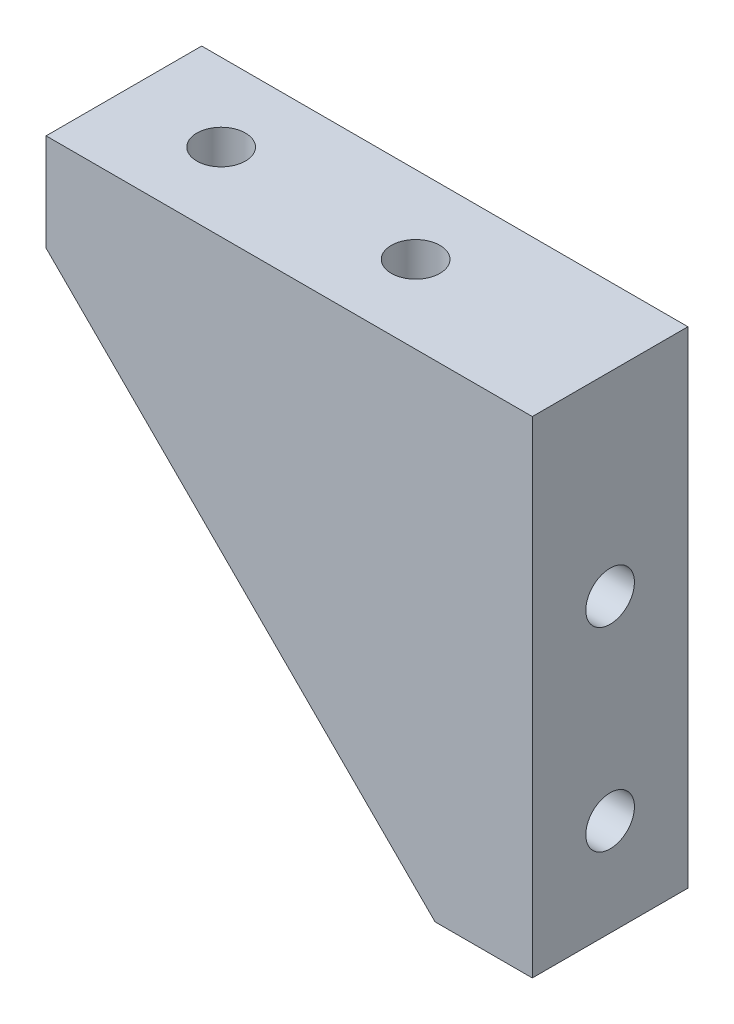
ISO-10303-21;
HEADER;
FILE_DESCRIPTION(('STEP AP214'),'2;1');
FILE_NAME('part.step','',(''),(''),'','','');
FILE_SCHEMA(('AUTOMOTIVE_DESIGN { 1 0 10303 214 1 1 1 1 }'));
ENDSEC;
DATA;
#1=APPLICATION_CONTEXT('core data for automotive mechanical design processes');
#2=APPLICATION_PROTOCOL_DEFINITION('international standard','automotive_design',2000,#1);
#3=PRODUCT_CONTEXT('',#1,'mechanical');
#4=PRODUCT('Part','Part','',(#3));
#5=PRODUCT_RELATED_PRODUCT_CATEGORY('part','',(#4));
#6=PRODUCT_DEFINITION_FORMATION('','',#4);
#7=PRODUCT_DEFINITION_CONTEXT('part definition',#1,'design');
#8=PRODUCT_DEFINITION('design','',#6,#7);
#9=PRODUCT_DEFINITION_SHAPE('','',#8);
#10=(LENGTH_UNIT() NAMED_UNIT(*) SI_UNIT(.MILLI.,.METRE.));
#11=(NAMED_UNIT(*) PLANE_ANGLE_UNIT() SI_UNIT($,.RADIAN.));
#12=(NAMED_UNIT(*) SI_UNIT($,.STERADIAN.) SOLID_ANGLE_UNIT());
#13=UNCERTAINTY_MEASURE_WITH_UNIT(LENGTH_MEASURE(1.E-05),#10,'distance_accuracy_value','');
#14=(GEOMETRIC_REPRESENTATION_CONTEXT(3) GLOBAL_UNCERTAINTY_ASSIGNED_CONTEXT((#13)) GLOBAL_UNIT_ASSIGNED_CONTEXT((#10,
#11,#12)) REPRESENTATION_CONTEXT('',''));
#15=CARTESIAN_POINT('',(0.,0.,0.));
#16=DIRECTION('',(0.,0.,1.));
#17=DIRECTION('',(1.,0.,0.));
#18=AXIS2_PLACEMENT_3D('',#15,#16,#17);
#19=CARTESIAN_POINT('',(2.5,-37.5,4.));
#20=DIRECTION('',(0.,1.,0.));
#21=DIRECTION('',(0.,0.,1.));
#22=AXIS2_PLACEMENT_3D('',#19,#20,#21);
#23=CYLINDRICAL_SURFACE('',#22,1.25);
#24=CARTESIAN_POINT('',(2.5,2.5,4.));
#25=DIRECTION('',(-0.707106781186548,0.707106781186547,0.));
#26=DIRECTION('',(0.707106781186547,0.707106781186547,0.));
#27=AXIS2_PLACEMENT_3D('',#24,#25,#26);
#28=ELLIPSE('',#27,1.76776695296637,1.25);
#29=CARTESIAN_POINT('',(2.5,2.5,2.75));
#30=VERTEX_POINT('',#29);
#31=CARTESIAN_POINT('',(2.5,2.5,5.25));
#32=VERTEX_POINT('',#31);
#33=EDGE_CURVE('E140',#30,#32,#28,.T.);
#34=ORIENTED_EDGE('',*,*,#33,.T.);
#35=CARTESIAN_POINT('',(2.5,2.5,4.));
#36=DIRECTION('',(0.707106781186547,0.707106781186547,0.));
#37=DIRECTION('',(-0.707106781186548,0.707106781186547,0.));
#38=AXIS2_PLACEMENT_3D('',#35,#36,#37);
#39=ELLIPSE('',#38,1.76776695296637,1.25);
#40=EDGE_CURVE('E143',#32,#30,#39,.T.);
#41=ORIENTED_EDGE('',*,*,#40,.T.);
#42=EDGE_LOOP('',(#34,#41));
#43=FACE_BOUND('',#42,.T.);
#44=CARTESIAN_POINT('',(2.5,-7.5,4.));
#45=DIRECTION('',(-0.707106781186548,0.707106781186547,0.));
#46=DIRECTION('',(0.707106781186547,0.707106781186547,0.));
#47=AXIS2_PLACEMENT_3D('',#44,#45,#46);
#48=ELLIPSE('',#47,1.76776695296637,1.25);
#49=CARTESIAN_POINT('',(2.5,-7.5,2.75));
#50=VERTEX_POINT('',#49);
#51=CARTESIAN_POINT('',(2.5,-7.5,5.25));
#52=VERTEX_POINT('',#51);
#53=EDGE_CURVE('E148',#50,#52,#48,.F.);
#54=ORIENTED_EDGE('',*,*,#53,.T.);
#55=CARTESIAN_POINT('',(2.5,-7.5,4.));
#56=DIRECTION('',(0.707106781186547,0.707106781186547,0.));
#57=DIRECTION('',(-0.707106781186548,0.707106781186547,0.));
#58=AXIS2_PLACEMENT_3D('',#55,#56,#57);
#59=ELLIPSE('',#58,1.76776695296637,1.25);
#60=EDGE_CURVE('E11',#52,#50,#59,.F.);
#61=ORIENTED_EDGE('',*,*,#60,.T.);
#62=EDGE_LOOP('',(#54,#61));
#63=FACE_BOUND('',#62,.T.);
#64=ADVANCED_FACE('F34',(#43,#63),#23,.F.);
#65=CARTESIAN_POINT('',(-7.5,-37.5,4.));
#66=DIRECTION('',(0.,1.,0.));
#67=DIRECTION('',(0.,0.,1.));
#68=AXIS2_PLACEMENT_3D('',#65,#66,#67);
#69=CYLINDRICAL_SURFACE('',#68,1.25);
#70=CARTESIAN_POINT('',(-7.5,12.5,4.));
#71=DIRECTION('',(0.,1.,0.));
#72=DIRECTION('',(0.,0.,1.));
#73=AXIS2_PLACEMENT_3D('',#70,#71,#72);
#74=CIRCLE('',#73,1.25);
#75=CARTESIAN_POINT('',(-7.5,12.5,5.25));
#76=VERTEX_POINT('',#75);
#77=EDGE_CURVE('E178',#76,#76,#74,.T.);
#78=ORIENTED_EDGE('',*,*,#77,.T.);
#79=EDGE_LOOP('',(#78));
#80=FACE_BOUND('',#79,.T.);
#81=CARTESIAN_POINT('',(-7.5,2.5,4.));
#82=DIRECTION('',(-0.707106781186548,0.707106781186547,0.));
#83=DIRECTION('',(0.707106781186547,0.707106781186547,0.));
#84=AXIS2_PLACEMENT_3D('',#81,#82,#83);
#85=ELLIPSE('',#84,1.76776695296637,1.25);
#86=CARTESIAN_POINT('',(-7.5,2.5,2.75));
#87=VERTEX_POINT('',#86);
#88=CARTESIAN_POINT('',(-7.5,2.5,5.25));
#89=VERTEX_POINT('',#88);
#90=EDGE_CURVE('E212',#87,#89,#85,.F.);
#91=ORIENTED_EDGE('',*,*,#90,.T.);
#92=CARTESIAN_POINT('',(-7.5,2.5,4.));
#93=DIRECTION('',(0.707106781186547,0.707106781186547,0.));
#94=DIRECTION('',(-0.707106781186548,0.707106781186547,0.));
#95=AXIS2_PLACEMENT_3D('',#92,#93,#94);
#96=ELLIPSE('',#95,1.76776695296637,1.25);
#97=EDGE_CURVE('E179',#89,#87,#96,.F.);
#98=ORIENTED_EDGE('',*,*,#97,.T.);
#99=EDGE_LOOP('',(#91,#98));
#100=FACE_BOUND('',#99,.T.);
#101=ADVANCED_FACE('F157',(#80,#100),#69,.F.);
#102=CARTESIAN_POINT('',(2.5,12.5,4.));
#103=DIRECTION('',(0.,1.,0.));
#104=DIRECTION('',(0.,0.,1.));
#105=AXIS2_PLACEMENT_3D('',#102,#103,#104);
#106=CIRCLE('',#105,1.25);
#107=CARTESIAN_POINT('',(2.5,12.5,5.25));
#108=VERTEX_POINT('',#107);
#109=EDGE_CURVE('E176',#108,#108,#106,.T.);
#110=ORIENTED_EDGE('',*,*,#109,.T.);
#111=EDGE_LOOP('',(#110));
#112=FACE_BOUND('',#111,.T.);
#113=CARTESIAN_POINT('',(2.5,2.5,4.));
#114=DIRECTION('',(-0.707106781186548,0.707106781186547,0.));
#115=DIRECTION('',(0.707106781186547,0.707106781186547,0.));
#116=AXIS2_PLACEMENT_3D('',#113,#114,#115);
#117=ELLIPSE('',#116,1.76776695296637,1.25);
#118=EDGE_CURVE('E56',#30,#32,#117,.F.);
#119=ORIENTED_EDGE('',*,*,#118,.T.);
#120=CARTESIAN_POINT('',(2.5,2.5,4.));
#121=DIRECTION('',(0.707106781186547,0.707106781186547,0.));
#122=DIRECTION('',(-0.707106781186548,0.707106781186547,0.));
#123=AXIS2_PLACEMENT_3D('',#120,#121,#122);
#124=ELLIPSE('',#123,1.76776695296637,1.25);
#125=EDGE_CURVE('E146',#32,#30,#124,.F.);
#126=ORIENTED_EDGE('',*,*,#125,.T.);
#127=EDGE_LOOP('',(#119,#126));
#128=FACE_BOUND('',#127,.T.);
#129=ADVANCED_FACE('F160',(#112,#128),#23,.F.);
#130=CARTESIAN_POINT('',(12.5,12.5,8.));
#131=DIRECTION('',(-1.,0.,0.));
#132=DIRECTION('',(0.,-1.,0.));
#133=AXIS2_PLACEMENT_3D('',#130,#131,#132);
#134=PLANE('',#133);
#135=CARTESIAN_POINT('',(12.5,-7.5,4.));
#136=DIRECTION('',(1.,0.,0.));
#137=DIRECTION('',(0.,1.,0.));
#138=AXIS2_PLACEMENT_3D('',#135,#136,#137);
#139=CIRCLE('',#138,1.25);
#140=CARTESIAN_POINT('',(12.5,-6.25,4.));
#141=VERTEX_POINT('',#140);
#142=EDGE_CURVE('E203',#141,#141,#139,.T.);
#143=ORIENTED_EDGE('',*,*,#142,.F.);
#144=EDGE_LOOP('',(#143));
#145=FACE_BOUND('',#144,.T.);
#146=CARTESIAN_POINT('',(12.5,2.5,4.));
#147=DIRECTION('',(1.,0.,0.));
#148=DIRECTION('',(0.,1.,0.));
#149=AXIS2_PLACEMENT_3D('',#146,#147,#148);
#150=CIRCLE('',#149,1.25);
#151=CARTESIAN_POINT('',(12.5,3.75,4.));
#152=VERTEX_POINT('',#151);
#153=EDGE_CURVE('E206',#152,#152,#150,.T.);
#154=ORIENTED_EDGE('',*,*,#153,.F.);
#155=EDGE_LOOP('',(#154));
#156=FACE_BOUND('',#155,.T.);
#157=DIRECTION('',(0.,1.,0.));
#158=VECTOR('',#157,1.);
#159=CARTESIAN_POINT('',(12.5,12.5,0.));
#160=LINE('',#159,#158);
#161=CARTESIAN_POINT('',(12.5,-12.5,0.));
#162=VERTEX_POINT('',#161);
#163=CARTESIAN_POINT('',(12.5,12.5,0.));
#164=VERTEX_POINT('',#163);
#165=EDGE_CURVE('E120',#162,#164,#160,.T.);
#166=ORIENTED_EDGE('',*,*,#165,.T.);
#167=DIRECTION('',(0.,0.,-1.));
#168=VECTOR('',#167,1.);
#169=CARTESIAN_POINT('',(12.5,12.5,8.));
#170=LINE('',#169,#168);
#171=CARTESIAN_POINT('',(12.5,12.5,8.));
#172=VERTEX_POINT('',#171);
#173=EDGE_CURVE('E136',#172,#164,#170,.T.);
#174=ORIENTED_EDGE('',*,*,#173,.F.);
#175=DIRECTION('',(0.,1.,0.));
#176=VECTOR('',#175,1.);
#177=CARTESIAN_POINT('',(12.5,12.5,8.));
#178=LINE('',#177,#176);
#179=CARTESIAN_POINT('',(12.5,-12.5,8.));
#180=VERTEX_POINT('',#179);
#181=EDGE_CURVE('E121',#180,#172,#178,.T.);
#182=ORIENTED_EDGE('',*,*,#181,.F.);
#183=DIRECTION('',(0.,0.,-1.));
#184=VECTOR('',#183,1.);
#185=CARTESIAN_POINT('',(12.5,-12.5,8.));
#186=LINE('',#185,#184);
#187=EDGE_CURVE('E131',#180,#162,#186,.T.);
#188=ORIENTED_EDGE('',*,*,#187,.T.);
#189=EDGE_LOOP('',(#166,#174,#182,#188));
#190=FACE_BOUND('',#189,.T.);
#191=ADVANCED_FACE('F36',(#145,#156,#190),#134,.F.);
#192=CARTESIAN_POINT('',(-12.5,12.5,8.));
#193=DIRECTION('',(0.,-1.,0.));
#194=DIRECTION('',(0.,0.,-1.));
#195=AXIS2_PLACEMENT_3D('',#192,#193,#194);
#196=PLANE('',#195);
#197=ORIENTED_EDGE('',*,*,#109,.F.);
#198=EDGE_LOOP('',(#197));
#199=FACE_BOUND('',#198,.T.);
#200=ORIENTED_EDGE('',*,*,#77,.F.);
#201=EDGE_LOOP('',(#200));
#202=FACE_BOUND('',#201,.T.);
#203=DIRECTION('',(-1.,0.,0.));
#204=VECTOR('',#203,1.);
#205=CARTESIAN_POINT('',(-12.5,12.5,0.));
#206=LINE('',#205,#204);
#207=CARTESIAN_POINT('',(-12.5,12.5,0.));
#208=VERTEX_POINT('',#207);
#209=EDGE_CURVE('E127',#164,#208,#206,.T.);
#210=ORIENTED_EDGE('',*,*,#209,.T.);
#211=DIRECTION('',(0.,0.,-1.));
#212=VECTOR('',#211,1.);
#213=CARTESIAN_POINT('',(-12.5,12.5,8.));
#214=LINE('',#213,#212);
#215=CARTESIAN_POINT('',(-12.5,12.5,8.));
#216=VERTEX_POINT('',#215);
#217=EDGE_CURVE('E133',#216,#208,#214,.T.);
#218=ORIENTED_EDGE('',*,*,#217,.F.);
#219=DIRECTION('',(-1.,0.,0.));
#220=VECTOR('',#219,1.);
#221=CARTESIAN_POINT('',(-12.5,12.5,8.));
#222=LINE('',#221,#220);
#223=EDGE_CURVE('E125',#172,#216,#222,.T.);
#224=ORIENTED_EDGE('',*,*,#223,.F.);
#225=ORIENTED_EDGE('',*,*,#173,.T.);
#226=EDGE_LOOP('',(#210,#218,#224,#225));
#227=FACE_BOUND('',#226,.T.);
#228=ADVANCED_FACE('F172',(#199,#202,#227),#196,.F.);
#229=CARTESIAN_POINT('',(-12.5,12.5,8.));
#230=DIRECTION('',(1.,0.,0.));
#231=DIRECTION('',(0.,1.,0.));
#232=AXIS2_PLACEMENT_3D('',#229,#230,#231);
#233=PLANE('',#232);
#234=DIRECTION('',(0.,-1.,0.));
#235=VECTOR('',#234,1.);
#236=CARTESIAN_POINT('',(-12.5,12.5,0.));
#237=LINE('',#236,#235);
#238=CARTESIAN_POINT('',(-12.5,7.5,0.));
#239=VERTEX_POINT('',#238);
#240=EDGE_CURVE('E122',#208,#239,#237,.T.);
#241=ORIENTED_EDGE('',*,*,#240,.T.);
#242=DIRECTION('',(0.,0.,-1.));
#243=VECTOR('',#242,1.);
#244=CARTESIAN_POINT('',(-12.5,7.5,10.));
#245=LINE('',#244,#243);
#246=CARTESIAN_POINT('',(-12.5,7.5,8.));
#247=VERTEX_POINT('',#246);
#248=EDGE_CURVE('E49',#247,#239,#245,.T.);
#249=ORIENTED_EDGE('',*,*,#248,.F.);
#250=DIRECTION('',(0.,-1.,0.));
#251=VECTOR('',#250,1.);
#252=CARTESIAN_POINT('',(-12.5,12.5,8.));
#253=LINE('',#252,#251);
#254=EDGE_CURVE('E189',#216,#247,#253,.T.);
#255=ORIENTED_EDGE('',*,*,#254,.F.);
#256=ORIENTED_EDGE('',*,*,#217,.T.);
#257=EDGE_LOOP('',(#241,#249,#255,#256));
#258=FACE_BOUND('',#257,.T.);
#259=ADVANCED_FACE('F198',(#258),#233,.F.);
#260=CARTESIAN_POINT('',(-12.5,-12.5,8.));
#261=DIRECTION('',(0.,1.,0.));
#262=DIRECTION('',(0.,0.,1.));
#263=AXIS2_PLACEMENT_3D('',#260,#261,#262);
#264=PLANE('',#263);
#265=DIRECTION('',(1.,0.,0.));
#266=VECTOR('',#265,1.);
#267=CARTESIAN_POINT('',(-12.5,-12.5,8.));
#268=LINE('',#267,#266);
#269=CARTESIAN_POINT('',(7.5,-12.5,8.));
#270=VERTEX_POINT('',#269);
#271=EDGE_CURVE('E114',#270,#180,#268,.T.);
#272=ORIENTED_EDGE('',*,*,#271,.F.);
#273=DIRECTION('',(0.,0.,-1.));
#274=VECTOR('',#273,1.);
#275=CARTESIAN_POINT('',(7.5,-12.5,10.));
#276=LINE('',#275,#274);
#277=CARTESIAN_POINT('',(7.5,-12.5,0.));
#278=VERTEX_POINT('',#277);
#279=EDGE_CURVE('E101',#270,#278,#276,.T.);
#280=ORIENTED_EDGE('',*,*,#279,.T.);
#281=DIRECTION('',(1.,0.,0.));
#282=VECTOR('',#281,1.);
#283=CARTESIAN_POINT('',(-12.5,-12.5,0.));
#284=LINE('',#283,#282);
#285=EDGE_CURVE('E112',#278,#162,#284,.T.);
#286=ORIENTED_EDGE('',*,*,#285,.T.);
#287=ORIENTED_EDGE('',*,*,#187,.F.);
#288=EDGE_LOOP('',(#272,#280,#286,#287));
#289=FACE_BOUND('',#288,.T.);
#290=ADVANCED_FACE('F110',(#289),#264,.F.);
#291=CARTESIAN_POINT('',(0.,0.,8.));
#292=DIRECTION('',(0.,0.,1.));
#293=DIRECTION('',(1.,0.,0.));
#294=AXIS2_PLACEMENT_3D('',#291,#292,#293);
#295=PLANE('',#294);
#296=DIRECTION('',(-0.707106781186548,0.707106781186548,0.));
#297=VECTOR('',#296,1.);
#298=CARTESIAN_POINT('',(-2.5,-2.5,8.));
#299=LINE('',#298,#297);
#300=EDGE_CURVE('E115',#270,#247,#299,.T.);
#301=ORIENTED_EDGE('',*,*,#300,.F.);
#302=ORIENTED_EDGE('',*,*,#271,.T.);
#303=ORIENTED_EDGE('',*,*,#181,.T.);
#304=ORIENTED_EDGE('',*,*,#223,.T.);
#305=ORIENTED_EDGE('',*,*,#254,.T.);
#306=EDGE_LOOP('',(#301,#302,#303,#304,#305));
#307=FACE_BOUND('',#306,.T.);
#308=ADVANCED_FACE('F200',(#307),#295,.T.);
#309=CARTESIAN_POINT('',(0.,0.,0.));
#310=DIRECTION('',(0.,0.,1.));
#311=DIRECTION('',(1.,0.,0.));
#312=AXIS2_PLACEMENT_3D('',#309,#310,#311);
#313=PLANE('',#312);
#314=ORIENTED_EDGE('',*,*,#285,.F.);
#315=DIRECTION('',(0.707106781186548,-0.707106781186548,0.));
#316=VECTOR('',#315,1.);
#317=CARTESIAN_POINT('',(-12.5,7.5,0.));
#318=LINE('',#317,#316);
#319=EDGE_CURVE('E97',#239,#278,#318,.T.);
#320=ORIENTED_EDGE('',*,*,#319,.F.);
#321=ORIENTED_EDGE('',*,*,#240,.F.);
#322=ORIENTED_EDGE('',*,*,#209,.F.);
#323=ORIENTED_EDGE('',*,*,#165,.F.);
#324=EDGE_LOOP('',(#314,#320,#321,#322,#323));
#325=FACE_BOUND('',#324,.T.);
#326=ADVANCED_FACE('F118',(#325),#313,.F.);
#327=CARTESIAN_POINT('',(-37.5,2.5,4.));
#328=DIRECTION('',(1.,0.,0.));
#329=DIRECTION('',(0.,1.,0.));
#330=AXIS2_PLACEMENT_3D('',#327,#328,#329);
#331=CYLINDRICAL_SURFACE('',#330,1.25);
#332=ORIENTED_EDGE('',*,*,#153,.T.);
#333=EDGE_LOOP('',(#332));
#334=FACE_BOUND('',#333,.T.);
#335=ORIENTED_EDGE('',*,*,#118,.F.);
#336=ORIENTED_EDGE('',*,*,#40,.F.);
#337=EDGE_LOOP('',(#335,#336));
#338=FACE_BOUND('',#337,.T.);
#339=ADVANCED_FACE('F220',(#334,#338),#331,.F.);
#340=ORIENTED_EDGE('',*,*,#33,.F.);
#341=ORIENTED_EDGE('',*,*,#125,.F.);
#342=EDGE_LOOP('',(#340,#341));
#343=FACE_BOUND('',#342,.T.);
#344=ORIENTED_EDGE('',*,*,#90,.F.);
#345=CARTESIAN_POINT('',(-7.5,2.5,4.));
#346=DIRECTION('',(0.707106781186547,0.707106781186547,0.));
#347=DIRECTION('',(-0.707106781186548,0.707106781186547,0.));
#348=AXIS2_PLACEMENT_3D('',#345,#346,#347);
#349=ELLIPSE('',#348,1.76776695296637,1.25);
#350=EDGE_CURVE('E184',#89,#87,#349,.T.);
#351=ORIENTED_EDGE('',*,*,#350,.F.);
#352=EDGE_LOOP('',(#344,#351));
#353=FACE_BOUND('',#352,.T.);
#354=ADVANCED_FACE('F217',(#343,#353),#331,.F.);
#355=CARTESIAN_POINT('',(-37.5,-7.5,4.));
#356=DIRECTION('',(1.,0.,0.));
#357=DIRECTION('',(0.,1.,0.));
#358=AXIS2_PLACEMENT_3D('',#355,#356,#357);
#359=CYLINDRICAL_SURFACE('',#358,1.25);
#360=ORIENTED_EDGE('',*,*,#142,.T.);
#361=EDGE_LOOP('',(#360));
#362=FACE_BOUND('',#361,.T.);
#363=ORIENTED_EDGE('',*,*,#53,.F.);
#364=CARTESIAN_POINT('',(2.5,-7.5,4.));
#365=DIRECTION('',(0.707106781186547,0.707106781186547,0.));
#366=DIRECTION('',(-0.707106781186548,0.707106781186547,0.));
#367=AXIS2_PLACEMENT_3D('',#364,#365,#366);
#368=ELLIPSE('',#367,1.76776695296637,1.25);
#369=EDGE_CURVE('E42',#52,#50,#368,.T.);
#370=ORIENTED_EDGE('',*,*,#369,.F.);
#371=EDGE_LOOP('',(#363,#370));
#372=FACE_BOUND('',#371,.T.);
#373=ADVANCED_FACE('F154',(#362,#372),#359,.F.);
#374=CARTESIAN_POINT('',(-12.5,7.5,10.));
#375=DIRECTION('',(0.707106781186548,0.707106781186548,0.));
#376=DIRECTION('',(-0.707106781186548,0.707106781186548,0.));
#377=AXIS2_PLACEMENT_3D('',#374,#375,#376);
#378=PLANE('',#377);
#379=ORIENTED_EDGE('',*,*,#300,.T.);
#380=ORIENTED_EDGE('',*,*,#248,.T.);
#381=ORIENTED_EDGE('',*,*,#319,.T.);
#382=ORIENTED_EDGE('',*,*,#279,.F.);
#383=EDGE_LOOP('',(#379,#380,#381,#382));
#384=FACE_BOUND('',#383,.T.);
#385=ORIENTED_EDGE('',*,*,#60,.F.);
#386=ORIENTED_EDGE('',*,*,#369,.T.);
#387=EDGE_LOOP('',(#385,#386));
#388=FACE_BOUND('',#387,.T.);
#389=ORIENTED_EDGE('',*,*,#97,.F.);
#390=ORIENTED_EDGE('',*,*,#350,.T.);
#391=EDGE_LOOP('',(#389,#390));
#392=FACE_BOUND('',#391,.T.);
#393=ADVANCED_FACE('F99',(#384,#388,#392),#378,.F.);
#394=CLOSED_SHELL('',(#64,#101,#129,#191,#228,#259,#290,#308,#326,#339,#354,#373,#393));
#395=MANIFOLD_SOLID_BREP('B2',#394);
#396=ADVANCED_BREP_SHAPE_REPRESENTATION('',(#18,#395),#14);
#397=SHAPE_DEFINITION_REPRESENTATION(#9,#396);
ENDSEC;
END-ISO-10303-21;
